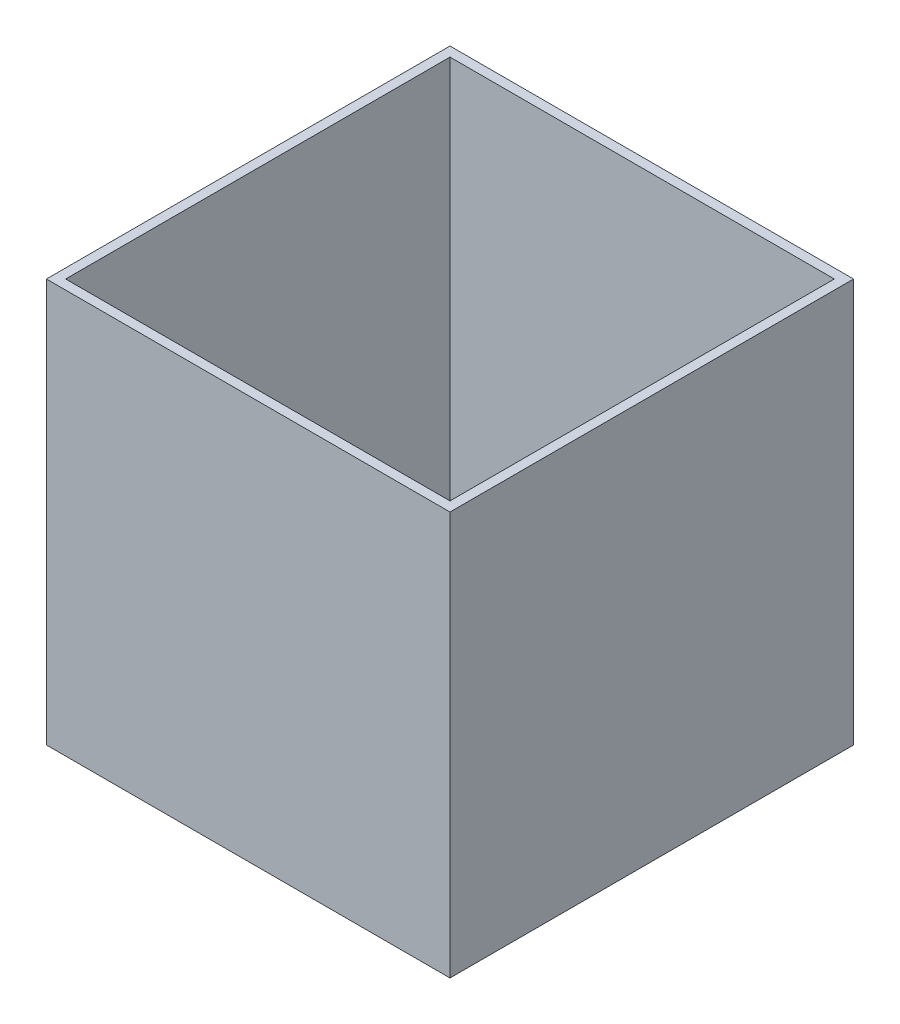
ISO-10303-21;
HEADER;
FILE_DESCRIPTION(('STEP AP214'),'2;1');
FILE_NAME('part.step','',(''),(''),'','','');
FILE_SCHEMA(('AUTOMOTIVE_DESIGN { 1 0 10303 214 1 1 1 1 }'));
ENDSEC;
DATA;
#1=APPLICATION_CONTEXT('core data for automotive mechanical design processes');
#2=APPLICATION_PROTOCOL_DEFINITION('international standard','automotive_design',2000,#1);
#3=PRODUCT_CONTEXT('',#1,'mechanical');
#4=PRODUCT('Part','Part','',(#3));
#5=PRODUCT_RELATED_PRODUCT_CATEGORY('part','',(#4));
#6=PRODUCT_DEFINITION_FORMATION('','',#4);
#7=PRODUCT_DEFINITION_CONTEXT('part definition',#1,'design');
#8=PRODUCT_DEFINITION('design','',#6,#7);
#9=PRODUCT_DEFINITION_SHAPE('','',#8);
#10=(LENGTH_UNIT() NAMED_UNIT(*) SI_UNIT(.MILLI.,.METRE.));
#11=(NAMED_UNIT(*) PLANE_ANGLE_UNIT() SI_UNIT($,.RADIAN.));
#12=(NAMED_UNIT(*) SI_UNIT($,.STERADIAN.) SOLID_ANGLE_UNIT());
#13=UNCERTAINTY_MEASURE_WITH_UNIT(LENGTH_MEASURE(1.E-05),#10,'distance_accuracy_value','');
#14=(GEOMETRIC_REPRESENTATION_CONTEXT(3) GLOBAL_UNCERTAINTY_ASSIGNED_CONTEXT((#13)) GLOBAL_UNIT_ASSIGNED_CONTEXT((#10,
#11,#12)) REPRESENTATION_CONTEXT('',''));
#15=CARTESIAN_POINT('',(0.,0.,0.));
#16=DIRECTION('',(0.,0.,1.));
#17=DIRECTION('',(1.,0.,0.));
#18=AXIS2_PLACEMENT_3D('',#15,#16,#17);
#19=CARTESIAN_POINT('',(21.,42.,-21.));
#20=DIRECTION('',(-1.,0.,0.));
#21=DIRECTION('',(0.,0.,1.));
#22=AXIS2_PLACEMENT_3D('',#19,#20,#21);
#23=PLANE('',#22);
#24=DIRECTION('',(0.,0.,-1.));
#25=VECTOR('',#24,1.);
#26=CARTESIAN_POINT('',(21.,0.,-21.));
#27=LINE('',#26,#25);
#28=CARTESIAN_POINT('',(21.,0.,21.));
#29=VERTEX_POINT('',#28);
#30=CARTESIAN_POINT('',(21.,0.,-21.));
#31=VERTEX_POINT('',#30);
#32=EDGE_CURVE('E143',#29,#31,#27,.T.);
#33=ORIENTED_EDGE('',*,*,#32,.T.);
#34=DIRECTION('',(0.,-1.,0.));
#35=VECTOR('',#34,1.);
#36=CARTESIAN_POINT('',(21.,42.,-21.));
#37=LINE('',#36,#35);
#38=CARTESIAN_POINT('',(21.,42.,-21.));
#39=VERTEX_POINT('',#38);
#40=EDGE_CURVE('E11',#39,#31,#37,.T.);
#41=ORIENTED_EDGE('',*,*,#40,.F.);
#42=DIRECTION('',(0.,0.,-1.));
#43=VECTOR('',#42,1.);
#44=CARTESIAN_POINT('',(21.,42.,-21.));
#45=LINE('',#44,#43);
#46=CARTESIAN_POINT('',(21.,42.,21.));
#47=VERTEX_POINT('',#46);
#48=EDGE_CURVE('E147',#47,#39,#45,.T.);
#49=ORIENTED_EDGE('',*,*,#48,.F.);
#50=DIRECTION('',(0.,-1.,0.));
#51=VECTOR('',#50,1.);
#52=CARTESIAN_POINT('',(21.,42.,21.));
#53=LINE('',#52,#51);
#54=EDGE_CURVE('E153',#47,#29,#53,.T.);
#55=ORIENTED_EDGE('',*,*,#54,.T.);
#56=EDGE_LOOP('',(#33,#41,#49,#55));
#57=FACE_BOUND('',#56,.T.);
#58=ADVANCED_FACE('F35',(#57),#23,.F.);
#59=CARTESIAN_POINT('',(-21.,42.,-21.));
#60=DIRECTION('',(0.,0.,1.));
#61=DIRECTION('',(1.,0.,0.));
#62=AXIS2_PLACEMENT_3D('',#59,#60,#61);
#63=PLANE('',#62);
#64=DIRECTION('',(-1.,0.,0.));
#65=VECTOR('',#64,1.);
#66=CARTESIAN_POINT('',(-21.,0.,-21.));
#67=LINE('',#66,#65);
#68=CARTESIAN_POINT('',(-21.,0.,-21.));
#69=VERTEX_POINT('',#68);
#70=EDGE_CURVE('E156',#31,#69,#67,.T.);
#71=ORIENTED_EDGE('',*,*,#70,.T.);
#72=DIRECTION('',(0.,-1.,0.));
#73=VECTOR('',#72,1.);
#74=CARTESIAN_POINT('',(-21.,42.,-21.));
#75=LINE('',#74,#73);
#76=CARTESIAN_POINT('',(-21.,42.,-21.));
#77=VERTEX_POINT('',#76);
#78=EDGE_CURVE('E42',#77,#69,#75,.T.);
#79=ORIENTED_EDGE('',*,*,#78,.F.);
#80=DIRECTION('',(-1.,0.,0.));
#81=VECTOR('',#80,1.);
#82=CARTESIAN_POINT('',(-21.,42.,-21.));
#83=LINE('',#82,#81);
#84=EDGE_CURVE('E86',#39,#77,#83,.T.);
#85=ORIENTED_EDGE('',*,*,#84,.F.);
#86=ORIENTED_EDGE('',*,*,#40,.T.);
#87=EDGE_LOOP('',(#71,#79,#85,#86));
#88=FACE_BOUND('',#87,.T.);
#89=ADVANCED_FACE('F185',(#88),#63,.F.);
#90=CARTESIAN_POINT('',(-21.,42.,-21.));
#91=DIRECTION('',(1.,0.,0.));
#92=DIRECTION('',(0.,0.,-1.));
#93=AXIS2_PLACEMENT_3D('',#90,#91,#92);
#94=PLANE('',#93);
#95=DIRECTION('',(0.,0.,1.));
#96=VECTOR('',#95,1.);
#97=CARTESIAN_POINT('',(-21.,0.,-21.));
#98=LINE('',#97,#96);
#99=CARTESIAN_POINT('',(-21.,0.,21.));
#100=VERTEX_POINT('',#99);
#101=EDGE_CURVE('E158',#69,#100,#98,.T.);
#102=ORIENTED_EDGE('',*,*,#101,.T.);
#103=DIRECTION('',(0.,-1.,0.));
#104=VECTOR('',#103,1.);
#105=CARTESIAN_POINT('',(-21.,42.,21.));
#106=LINE('',#105,#104);
#107=CARTESIAN_POINT('',(-21.,42.,21.));
#108=VERTEX_POINT('',#107);
#109=EDGE_CURVE('E162',#108,#100,#106,.T.);
#110=ORIENTED_EDGE('',*,*,#109,.F.);
#111=DIRECTION('',(0.,0.,1.));
#112=VECTOR('',#111,1.);
#113=CARTESIAN_POINT('',(-21.,42.,-21.));
#114=LINE('',#113,#112);
#115=EDGE_CURVE('E150',#77,#108,#114,.T.);
#116=ORIENTED_EDGE('',*,*,#115,.F.);
#117=ORIENTED_EDGE('',*,*,#78,.T.);
#118=EDGE_LOOP('',(#102,#110,#116,#117));
#119=FACE_BOUND('',#118,.T.);
#120=ADVANCED_FACE('F167',(#119),#94,.F.);
#121=CARTESIAN_POINT('',(-21.,42.,21.));
#122=DIRECTION('',(0.,0.,-1.));
#123=DIRECTION('',(-1.,0.,0.));
#124=AXIS2_PLACEMENT_3D('',#121,#122,#123);
#125=PLANE('',#124);
#126=DIRECTION('',(1.,0.,0.));
#127=VECTOR('',#126,1.);
#128=CARTESIAN_POINT('',(-21.,0.,21.));
#129=LINE('',#128,#127);
#130=EDGE_CURVE('E79',#100,#29,#129,.T.);
#131=ORIENTED_EDGE('',*,*,#130,.T.);
#132=ORIENTED_EDGE('',*,*,#54,.F.);
#133=DIRECTION('',(1.,0.,0.));
#134=VECTOR('',#133,1.);
#135=CARTESIAN_POINT('',(-21.,42.,21.));
#136=LINE('',#135,#134);
#137=EDGE_CURVE('E58',#108,#47,#136,.T.);
#138=ORIENTED_EDGE('',*,*,#137,.F.);
#139=ORIENTED_EDGE('',*,*,#109,.T.);
#140=EDGE_LOOP('',(#131,#132,#138,#139));
#141=FACE_BOUND('',#140,.T.);
#142=ADVANCED_FACE('F175',(#141),#125,.F.);
#143=CARTESIAN_POINT('',(0.,42.,0.));
#144=DIRECTION('',(0.,1.,0.));
#145=DIRECTION('',(0.,0.,1.));
#146=AXIS2_PLACEMENT_3D('',#143,#144,#145);
#147=PLANE('',#146);
#148=DIRECTION('',(0.,0.,-1.));
#149=VECTOR('',#148,1.);
#150=CARTESIAN_POINT('',(20.,42.,-20.));
#151=LINE('',#150,#149);
#152=CARTESIAN_POINT('',(20.,42.,20.));
#153=VERTEX_POINT('',#152);
#154=CARTESIAN_POINT('',(20.,42.,-20.));
#155=VERTEX_POINT('',#154);
#156=EDGE_CURVE('E49',#153,#155,#151,.T.);
#157=ORIENTED_EDGE('',*,*,#156,.F.);
#158=DIRECTION('',(1.,0.,0.));
#159=VECTOR('',#158,1.);
#160=CARTESIAN_POINT('',(-20.,42.,20.));
#161=LINE('',#160,#159);
#162=CARTESIAN_POINT('',(-20.,42.,20.));
#163=VERTEX_POINT('',#162);
#164=EDGE_CURVE('E128',#163,#153,#161,.T.);
#165=ORIENTED_EDGE('',*,*,#164,.F.);
#166=DIRECTION('',(0.,0.,1.));
#167=VECTOR('',#166,1.);
#168=CARTESIAN_POINT('',(-20.,42.,-20.));
#169=LINE('',#168,#167);
#170=CARTESIAN_POINT('',(-20.,42.,-20.));
#171=VERTEX_POINT('',#170);
#172=EDGE_CURVE('E131',#171,#163,#169,.T.);
#173=ORIENTED_EDGE('',*,*,#172,.F.);
#174=DIRECTION('',(-1.,0.,0.));
#175=VECTOR('',#174,1.);
#176=CARTESIAN_POINT('',(-20.,42.,-20.));
#177=LINE('',#176,#175);
#178=EDGE_CURVE('E137',#155,#171,#177,.T.);
#179=ORIENTED_EDGE('',*,*,#178,.F.);
#180=EDGE_LOOP('',(#157,#165,#173,#179));
#181=FACE_BOUND('',#180,.T.);
#182=ORIENTED_EDGE('',*,*,#48,.T.);
#183=ORIENTED_EDGE('',*,*,#84,.T.);
#184=ORIENTED_EDGE('',*,*,#115,.T.);
#185=ORIENTED_EDGE('',*,*,#137,.T.);
#186=EDGE_LOOP('',(#182,#183,#184,#185));
#187=FACE_BOUND('',#186,.T.);
#188=ADVANCED_FACE('F177',(#181,#187),#147,.T.);
#189=CARTESIAN_POINT('',(0.,0.,0.));
#190=DIRECTION('',(0.,1.,0.));
#191=DIRECTION('',(0.,0.,1.));
#192=AXIS2_PLACEMENT_3D('',#189,#190,#191);
#193=PLANE('',#192);
#194=ORIENTED_EDGE('',*,*,#32,.F.);
#195=ORIENTED_EDGE('',*,*,#130,.F.);
#196=ORIENTED_EDGE('',*,*,#101,.F.);
#197=ORIENTED_EDGE('',*,*,#70,.F.);
#198=EDGE_LOOP('',(#194,#195,#196,#197));
#199=FACE_BOUND('',#198,.T.);
#200=ADVANCED_FACE('F171',(#199),#193,.F.);
#201=CARTESIAN_POINT('',(20.,2.,-20.));
#202=DIRECTION('',(1.,0.,0.));
#203=DIRECTION('',(0.,0.,-1.));
#204=AXIS2_PLACEMENT_3D('',#201,#202,#203);
#205=PLANE('',#204);
#206=ORIENTED_EDGE('',*,*,#156,.T.);
#207=DIRECTION('',(0.,1.,0.));
#208=VECTOR('',#207,1.);
#209=CARTESIAN_POINT('',(20.,2.,-20.));
#210=LINE('',#209,#208);
#211=CARTESIAN_POINT('',(20.,2.,-20.));
#212=VERTEX_POINT('',#211);
#213=EDGE_CURVE('E106',#212,#155,#210,.T.);
#214=ORIENTED_EDGE('',*,*,#213,.F.);
#215=DIRECTION('',(0.,0.,-1.));
#216=VECTOR('',#215,1.);
#217=CARTESIAN_POINT('',(20.,2.,-20.));
#218=LINE('',#217,#216);
#219=CARTESIAN_POINT('',(20.,2.,20.));
#220=VERTEX_POINT('',#219);
#221=EDGE_CURVE('E110',#220,#212,#218,.T.);
#222=ORIENTED_EDGE('',*,*,#221,.F.);
#223=DIRECTION('',(0.,1.,0.));
#224=VECTOR('',#223,1.);
#225=CARTESIAN_POINT('',(20.,2.,20.));
#226=LINE('',#225,#224);
#227=EDGE_CURVE('E141',#220,#153,#226,.T.);
#228=ORIENTED_EDGE('',*,*,#227,.T.);
#229=EDGE_LOOP('',(#206,#214,#222,#228));
#230=FACE_BOUND('',#229,.T.);
#231=ADVANCED_FACE('F108',(#230),#205,.F.);
#232=CARTESIAN_POINT('',(-20.,2.,20.));
#233=DIRECTION('',(0.,0.,1.));
#234=DIRECTION('',(1.,0.,0.));
#235=AXIS2_PLACEMENT_3D('',#232,#233,#234);
#236=PLANE('',#235);
#237=ORIENTED_EDGE('',*,*,#164,.T.);
#238=ORIENTED_EDGE('',*,*,#227,.F.);
#239=DIRECTION('',(1.,0.,0.));
#240=VECTOR('',#239,1.);
#241=CARTESIAN_POINT('',(-20.,2.,20.));
#242=LINE('',#241,#240);
#243=CARTESIAN_POINT('',(-20.,2.,20.));
#244=VERTEX_POINT('',#243);
#245=EDGE_CURVE('E116',#244,#220,#242,.T.);
#246=ORIENTED_EDGE('',*,*,#245,.F.);
#247=DIRECTION('',(0.,1.,0.));
#248=VECTOR('',#247,1.);
#249=CARTESIAN_POINT('',(-20.,2.,20.));
#250=LINE('',#249,#248);
#251=EDGE_CURVE('E144',#244,#163,#250,.T.);
#252=ORIENTED_EDGE('',*,*,#251,.T.);
#253=EDGE_LOOP('',(#237,#238,#246,#252));
#254=FACE_BOUND('',#253,.T.);
#255=ADVANCED_FACE('F224',(#254),#236,.F.);
#256=CARTESIAN_POINT('',(-20.,2.,-20.));
#257=DIRECTION('',(-1.,0.,0.));
#258=DIRECTION('',(0.,0.,1.));
#259=AXIS2_PLACEMENT_3D('',#256,#257,#258);
#260=PLANE('',#259);
#261=ORIENTED_EDGE('',*,*,#172,.T.);
#262=ORIENTED_EDGE('',*,*,#251,.F.);
#263=DIRECTION('',(0.,0.,1.));
#264=VECTOR('',#263,1.);
#265=CARTESIAN_POINT('',(-20.,2.,-20.));
#266=LINE('',#265,#264);
#267=CARTESIAN_POINT('',(-20.,2.,-20.));
#268=VERTEX_POINT('',#267);
#269=EDGE_CURVE('E124',#268,#244,#266,.T.);
#270=ORIENTED_EDGE('',*,*,#269,.F.);
#271=DIRECTION('',(0.,1.,0.));
#272=VECTOR('',#271,1.);
#273=CARTESIAN_POINT('',(-20.,2.,-20.));
#274=LINE('',#273,#272);
#275=EDGE_CURVE('E115',#268,#171,#274,.T.);
#276=ORIENTED_EDGE('',*,*,#275,.T.);
#277=EDGE_LOOP('',(#261,#262,#270,#276));
#278=FACE_BOUND('',#277,.T.);
#279=ADVANCED_FACE('F233',(#278),#260,.F.);
#280=CARTESIAN_POINT('',(-20.,2.,-20.));
#281=DIRECTION('',(0.,0.,-1.));
#282=DIRECTION('',(-1.,0.,0.));
#283=AXIS2_PLACEMENT_3D('',#280,#281,#282);
#284=PLANE('',#283);
#285=ORIENTED_EDGE('',*,*,#178,.T.);
#286=ORIENTED_EDGE('',*,*,#275,.F.);
#287=DIRECTION('',(-1.,0.,0.));
#288=VECTOR('',#287,1.);
#289=CARTESIAN_POINT('',(-20.,2.,-20.));
#290=LINE('',#289,#288);
#291=EDGE_CURVE('E119',#212,#268,#290,.T.);
#292=ORIENTED_EDGE('',*,*,#291,.F.);
#293=ORIENTED_EDGE('',*,*,#213,.T.);
#294=EDGE_LOOP('',(#285,#286,#292,#293));
#295=FACE_BOUND('',#294,.T.);
#296=ADVANCED_FACE('F120',(#295),#284,.F.);
#297=CARTESIAN_POINT('',(0.,2.,0.));
#298=DIRECTION('',(0.,1.,0.));
#299=DIRECTION('',(0.,0.,1.));
#300=AXIS2_PLACEMENT_3D('',#297,#298,#299);
#301=PLANE('',#300);
#302=ORIENTED_EDGE('',*,*,#221,.T.);
#303=ORIENTED_EDGE('',*,*,#291,.T.);
#304=ORIENTED_EDGE('',*,*,#269,.T.);
#305=ORIENTED_EDGE('',*,*,#245,.T.);
#306=EDGE_LOOP('',(#302,#303,#304,#305));
#307=FACE_BOUND('',#306,.T.);
#308=ADVANCED_FACE('F126',(#307),#301,.T.);
#309=CLOSED_SHELL('',(#58,#89,#120,#142,#188,#200,#231,#255,#279,#296,#308));
#310=MANIFOLD_SOLID_BREP('B2',#309);
#311=ADVANCED_BREP_SHAPE_REPRESENTATION('',(#18,#310),#14);
#312=SHAPE_DEFINITION_REPRESENTATION(#9,#311);
ENDSEC;
END-ISO-10303-21;
